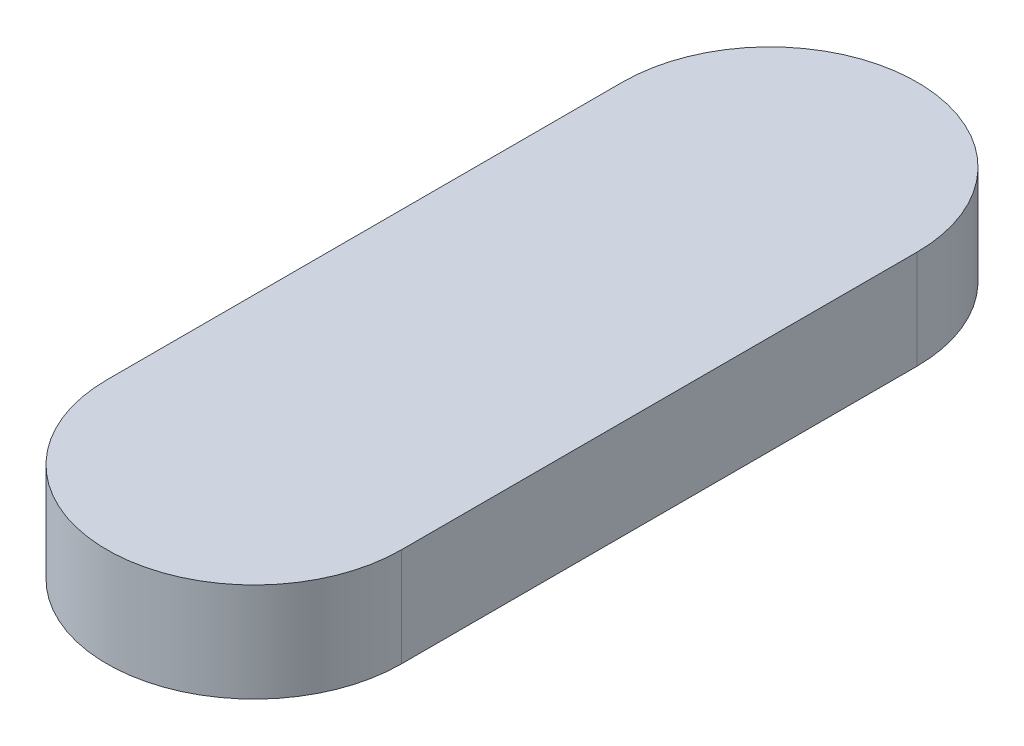
ISO-10303-21;
HEADER;
FILE_DESCRIPTION(('STEP AP214'),'2;1');
FILE_NAME('part.step','',(''),(''),'','','');
FILE_SCHEMA(('AUTOMOTIVE_DESIGN { 1 0 10303 214 1 1 1 1 }'));
ENDSEC;
DATA;
#1=APPLICATION_CONTEXT('core data for automotive mechanical design processes');
#2=APPLICATION_PROTOCOL_DEFINITION('international standard','automotive_design',2000,#1);
#3=PRODUCT_CONTEXT('',#1,'mechanical');
#4=PRODUCT('Part','Part','',(#3));
#5=PRODUCT_RELATED_PRODUCT_CATEGORY('part','',(#4));
#6=PRODUCT_DEFINITION_FORMATION('','',#4);
#7=PRODUCT_DEFINITION_CONTEXT('part definition',#1,'design');
#8=PRODUCT_DEFINITION('design','',#6,#7);
#9=PRODUCT_DEFINITION_SHAPE('','',#8);
#10=(LENGTH_UNIT() NAMED_UNIT(*) SI_UNIT(.MILLI.,.METRE.));
#11=(NAMED_UNIT(*) PLANE_ANGLE_UNIT() SI_UNIT($,.RADIAN.));
#12=(NAMED_UNIT(*) SI_UNIT($,.STERADIAN.) SOLID_ANGLE_UNIT());
#13=UNCERTAINTY_MEASURE_WITH_UNIT(LENGTH_MEASURE(1.E-05),#10,'distance_accuracy_value','');
#14=(GEOMETRIC_REPRESENTATION_CONTEXT(3) GLOBAL_UNCERTAINTY_ASSIGNED_CONTEXT((#13)) GLOBAL_UNIT_ASSIGNED_CONTEXT((#10,
#11,#12)) REPRESENTATION_CONTEXT('',''));
#15=CARTESIAN_POINT('',(0.,0.,0.));
#16=DIRECTION('',(0.,0.,1.));
#17=DIRECTION('',(1.,0.,0.));
#18=AXIS2_PLACEMENT_3D('',#15,#16,#17);
#19=CARTESIAN_POINT('',(291.935804762537,290.313647161554,386.686921170062));
#20=DIRECTION('',(0.,-1.,0.));
#21=DIRECTION('',(0.,0.,-1.));
#22=AXIS2_PLACEMENT_3D('',#19,#20,#21);
#23=CYLINDRICAL_SURFACE('',#22,3.71189620100415);
#24=CARTESIAN_POINT('',(291.935804762537,287.821822227896,386.686921170062));
#25=DIRECTION('',(0.,-1.,0.));
#26=DIRECTION('',(-1.,0.,0.));
#27=AXIS2_PLACEMENT_3D('',#24,#25,#26);
#28=CIRCLE('',#27,3.71189620100415);
#29=CARTESIAN_POINT('',(288.223908561533,287.821822227896,386.686921170062));
#30=VERTEX_POINT('',#29);
#31=CARTESIAN_POINT('',(295.647700963541,287.821822227896,386.686921170062));
#32=VERTEX_POINT('',#31);
#33=EDGE_CURVE('E79',#30,#32,#28,.T.);
#34=ORIENTED_EDGE('',*,*,#33,.F.);
#35=DIRECTION('',(0.,-1.,0.));
#36=VECTOR('',#35,1.);
#37=CARTESIAN_POINT('',(288.223908561533,290.313647161554,386.686921170062));
#38=LINE('',#37,#36);
#39=CARTESIAN_POINT('',(288.223908561533,290.313647161554,386.686921170062));
#40=VERTEX_POINT('',#39);
#41=EDGE_CURVE('E32',#40,#30,#38,.T.);
#42=ORIENTED_EDGE('',*,*,#41,.F.);
#43=CARTESIAN_POINT('',(291.935804762537,290.313647161554,386.686921170062));
#44=DIRECTION('',(0.,-1.,0.));
#45=DIRECTION('',(-1.,0.,0.));
#46=AXIS2_PLACEMENT_3D('',#43,#44,#45);
#47=CIRCLE('',#46,3.71189620100415);
#48=CARTESIAN_POINT('',(295.647700963541,290.313647161554,386.686921170062));
#49=VERTEX_POINT('',#48);
#50=EDGE_CURVE('E71',#40,#49,#47,.T.);
#51=ORIENTED_EDGE('',*,*,#50,.T.);
#52=DIRECTION('',(0.,-1.,0.));
#53=VECTOR('',#52,1.);
#54=CARTESIAN_POINT('',(295.647700963541,290.313647161554,386.686921170062));
#55=LINE('',#54,#53);
#56=EDGE_CURVE('E10',#49,#32,#55,.T.);
#57=ORIENTED_EDGE('',*,*,#56,.T.);
#58=EDGE_LOOP('',(#34,#42,#51,#57));
#59=FACE_BOUND('',#58,.T.);
#60=ADVANCED_FACE('F16',(#59),#23,.T.);
#61=CARTESIAN_POINT('',(295.647700963541,290.313647161554,386.686921170062));
#62=DIRECTION('',(1.,0.,0.));
#63=DIRECTION('',(0.,0.,-1.));
#64=AXIS2_PLACEMENT_3D('',#61,#62,#63);
#65=PLANE('',#64);
#66=DIRECTION('',(0.,0.,1.));
#67=VECTOR('',#66,1.);
#68=CARTESIAN_POINT('',(295.647700963541,287.821822227896,386.686921170062));
#69=LINE('',#68,#67);
#70=CARTESIAN_POINT('',(295.647700963541,287.821822227896,399.686921170061));
#71=VERTEX_POINT('',#70);
#72=EDGE_CURVE('E82',#32,#71,#69,.T.);
#73=ORIENTED_EDGE('',*,*,#72,.F.);
#74=ORIENTED_EDGE('',*,*,#56,.F.);
#75=DIRECTION('',(0.,0.,1.));
#76=VECTOR('',#75,1.);
#77=CARTESIAN_POINT('',(295.647700963541,290.313647161554,386.686921170062));
#78=LINE('',#77,#76);
#79=CARTESIAN_POINT('',(295.647700963541,290.313647161554,399.686921170061));
#80=VERTEX_POINT('',#79);
#81=EDGE_CURVE('E67',#49,#80,#78,.T.);
#82=ORIENTED_EDGE('',*,*,#81,.T.);
#83=DIRECTION('',(0.,-1.,0.));
#84=VECTOR('',#83,1.);
#85=CARTESIAN_POINT('',(295.647700963541,290.313647161554,399.686921170061));
#86=LINE('',#85,#84);
#87=EDGE_CURVE('E24',#80,#71,#86,.T.);
#88=ORIENTED_EDGE('',*,*,#87,.T.);
#89=EDGE_LOOP('',(#73,#74,#82,#88));
#90=FACE_BOUND('',#89,.T.);
#91=ADVANCED_FACE('F68',(#90),#65,.T.);
#92=CARTESIAN_POINT('',(291.935804762537,290.313647161554,399.686921170061));
#93=DIRECTION('',(0.,-1.,0.));
#94=DIRECTION('',(0.,0.,-1.));
#95=AXIS2_PLACEMENT_3D('',#92,#93,#94);
#96=CYLINDRICAL_SURFACE('',#95,3.71189620100415);
#97=CARTESIAN_POINT('',(291.935804762537,287.821822227896,399.686921170061));
#98=DIRECTION('',(0.,-1.,0.));
#99=DIRECTION('',(1.,0.,0.));
#100=AXIS2_PLACEMENT_3D('',#97,#98,#99);
#101=CIRCLE('',#100,3.71189620100415);
#102=CARTESIAN_POINT('',(288.223908561533,287.821822227896,399.686921170061));
#103=VERTEX_POINT('',#102);
#104=EDGE_CURVE('E65',#71,#103,#101,.T.);
#105=ORIENTED_EDGE('',*,*,#104,.F.);
#106=ORIENTED_EDGE('',*,*,#87,.F.);
#107=CARTESIAN_POINT('',(291.935804762537,290.313647161554,399.686921170061));
#108=DIRECTION('',(0.,-1.,0.));
#109=DIRECTION('',(1.,0.,0.));
#110=AXIS2_PLACEMENT_3D('',#107,#108,#109);
#111=CIRCLE('',#110,3.71189620100415);
#112=CARTESIAN_POINT('',(288.223908561533,290.313647161554,399.686921170061));
#113=VERTEX_POINT('',#112);
#114=EDGE_CURVE('E62',#80,#113,#111,.T.);
#115=ORIENTED_EDGE('',*,*,#114,.T.);
#116=DIRECTION('',(0.,-1.,0.));
#117=VECTOR('',#116,1.);
#118=CARTESIAN_POINT('',(288.223908561533,290.313647161554,399.686921170061));
#119=LINE('',#118,#117);
#120=EDGE_CURVE('E48',#113,#103,#119,.T.);
#121=ORIENTED_EDGE('',*,*,#120,.T.);
#122=EDGE_LOOP('',(#105,#106,#115,#121));
#123=FACE_BOUND('',#122,.T.);
#124=ADVANCED_FACE('F60',(#123),#96,.T.);
#125=CARTESIAN_POINT('',(288.223908561533,290.313647161554,399.686921170061));
#126=DIRECTION('',(-1.,0.,0.));
#127=DIRECTION('',(0.,0.,1.));
#128=AXIS2_PLACEMENT_3D('',#125,#126,#127);
#129=PLANE('',#128);
#130=DIRECTION('',(0.,0.,-1.));
#131=VECTOR('',#130,1.);
#132=CARTESIAN_POINT('',(288.223908561533,287.821822227896,399.686921170061));
#133=LINE('',#132,#131);
#134=EDGE_CURVE('E85',#103,#30,#133,.T.);
#135=ORIENTED_EDGE('',*,*,#134,.F.);
#136=ORIENTED_EDGE('',*,*,#120,.F.);
#137=DIRECTION('',(0.,0.,-1.));
#138=VECTOR('',#137,1.);
#139=CARTESIAN_POINT('',(288.223908561533,290.313647161554,399.686921170061));
#140=LINE('',#139,#138);
#141=EDGE_CURVE('E74',#113,#40,#140,.T.);
#142=ORIENTED_EDGE('',*,*,#141,.T.);
#143=ORIENTED_EDGE('',*,*,#41,.T.);
#144=EDGE_LOOP('',(#135,#136,#142,#143));
#145=FACE_BOUND('',#144,.T.);
#146=ADVANCED_FACE('F96',(#145),#129,.T.);
#147=CARTESIAN_POINT('',(246.935804762537,290.313647161554,223.186921170061));
#148=DIRECTION('',(0.,-1.,0.));
#149=DIRECTION('',(1.,0.,0.));
#150=AXIS2_PLACEMENT_3D('',#147,#148,#149);
#151=PLANE('',#150);
#152=ORIENTED_EDGE('',*,*,#50,.F.);
#153=ORIENTED_EDGE('',*,*,#141,.F.);
#154=ORIENTED_EDGE('',*,*,#114,.F.);
#155=ORIENTED_EDGE('',*,*,#81,.F.);
#156=EDGE_LOOP('',(#152,#153,#154,#155));
#157=FACE_BOUND('',#156,.T.);
#158=ADVANCED_FACE('F73',(#157),#151,.F.);
#159=CARTESIAN_POINT('',(246.935804762537,287.821822227896,223.186921170061));
#160=DIRECTION('',(0.,-1.,0.));
#161=DIRECTION('',(1.,0.,0.));
#162=AXIS2_PLACEMENT_3D('',#159,#160,#161);
#163=PLANE('',#162);
#164=ORIENTED_EDGE('',*,*,#33,.T.);
#165=ORIENTED_EDGE('',*,*,#72,.T.);
#166=ORIENTED_EDGE('',*,*,#104,.T.);
#167=ORIENTED_EDGE('',*,*,#134,.T.);
#168=EDGE_LOOP('',(#164,#165,#166,#167));
#169=FACE_BOUND('',#168,.T.);
#170=ADVANCED_FACE('F89',(#169),#163,.T.);
#171=CLOSED_SHELL('',(#60,#91,#124,#146,#158,#170));
#172=MANIFOLD_SOLID_BREP('B1',#171);
#173=ADVANCED_BREP_SHAPE_REPRESENTATION('',(#18,#172),#14);
#174=SHAPE_DEFINITION_REPRESENTATION(#9,#173);
ENDSEC;
END-ISO-10303-21;
